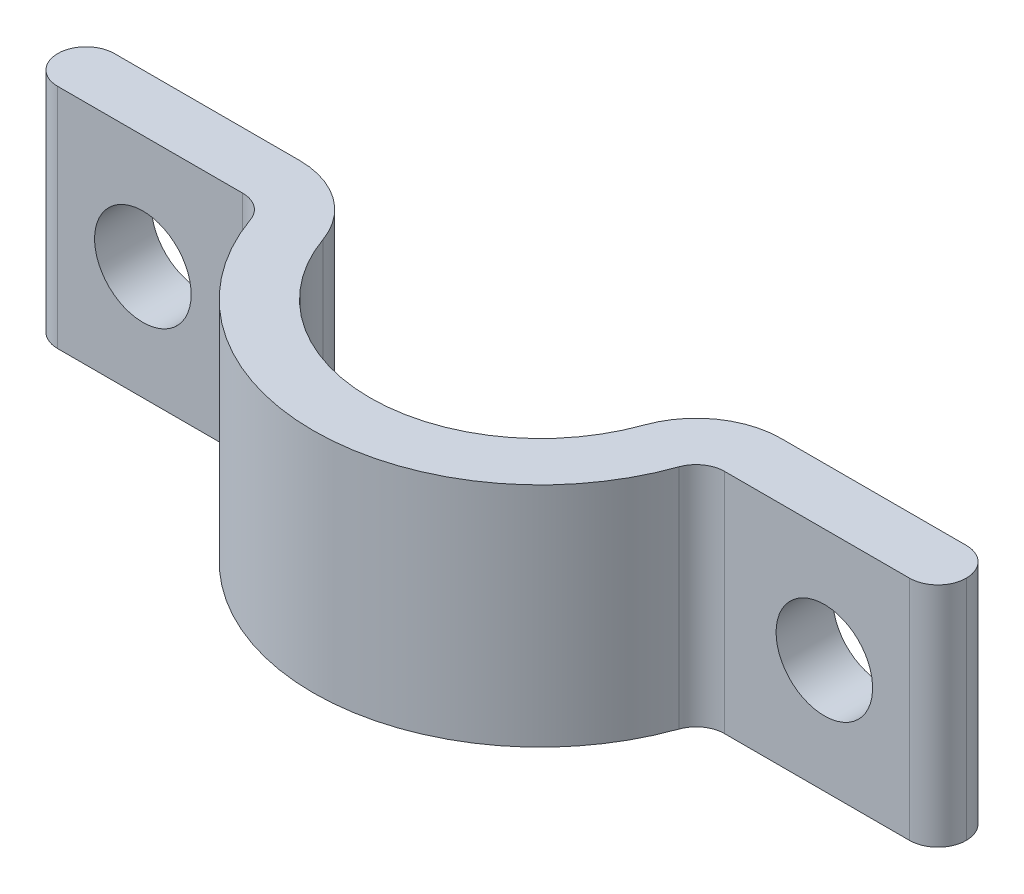
ISO-10303-21;
HEADER;
FILE_DESCRIPTION(('STEP AP214'),'2;1');
FILE_NAME('part.step','',(''),(''),'','','');
FILE_SCHEMA(('AUTOMOTIVE_DESIGN { 1 0 10303 214 1 1 1 1 }'));
ENDSEC;
DATA;
#1=APPLICATION_CONTEXT('core data for automotive mechanical design processes');
#2=APPLICATION_PROTOCOL_DEFINITION('international standard','automotive_design',2000,#1);
#3=PRODUCT_CONTEXT('',#1,'mechanical');
#4=PRODUCT('Part','Part','',(#3));
#5=PRODUCT_RELATED_PRODUCT_CATEGORY('part','',(#4));
#6=PRODUCT_DEFINITION_FORMATION('','',#4);
#7=PRODUCT_DEFINITION_CONTEXT('part definition',#1,'design');
#8=PRODUCT_DEFINITION('design','',#6,#7);
#9=PRODUCT_DEFINITION_SHAPE('','',#8);
#10=(LENGTH_UNIT() NAMED_UNIT(*) SI_UNIT(.MILLI.,.METRE.));
#11=(NAMED_UNIT(*) PLANE_ANGLE_UNIT() SI_UNIT($,.RADIAN.));
#12=(NAMED_UNIT(*) SI_UNIT($,.STERADIAN.) SOLID_ANGLE_UNIT());
#13=UNCERTAINTY_MEASURE_WITH_UNIT(LENGTH_MEASURE(1.E-05),#10,'distance_accuracy_value','');
#14=(GEOMETRIC_REPRESENTATION_CONTEXT(3) GLOBAL_UNCERTAINTY_ASSIGNED_CONTEXT((#13)) GLOBAL_UNIT_ASSIGNED_CONTEXT((#10,
#11,#12)) REPRESENTATION_CONTEXT('',''));
#15=CARTESIAN_POINT('',(0.,0.,0.));
#16=DIRECTION('',(0.,0.,1.));
#17=DIRECTION('',(1.,0.,0.));
#18=AXIS2_PLACEMENT_3D('',#15,#16,#17);
#19=CARTESIAN_POINT('',(-16.,8.,2.));
#20=DIRECTION('',(0.,0.,-1.));
#21=DIRECTION('',(-1.,0.,0.));
#22=AXIS2_PLACEMENT_3D('',#19,#20,#21);
#23=PLANE('',#22);
#24=CARTESIAN_POINT('',(-12.,4.,2.));
#25=DIRECTION('',(0.,0.,1.));
#26=DIRECTION('',(1.,0.,0.));
#27=AXIS2_PLACEMENT_3D('',#24,#25,#26);
#28=CIRCLE('',#27,1.7);
#29=CARTESIAN_POINT('',(-10.3,4.,2.));
#30=VERTEX_POINT('',#29);
#31=EDGE_CURVE('E206',#30,#30,#28,.T.);
#32=ORIENTED_EDGE('',*,*,#31,.F.);
#33=EDGE_LOOP('',(#32));
#34=FACE_BOUND('',#33,.T.);
#35=DIRECTION('',(1.,0.,0.));
#36=VECTOR('',#35,1.);
#37=CARTESIAN_POINT('',(-16.,8.,2.));
#38=LINE('',#37,#36);
#39=CARTESIAN_POINT('',(-15.,8.,2.));
#40=VERTEX_POINT('',#39);
#41=CARTESIAN_POINT('',(-8.48528137423857,8.,2.));
#42=VERTEX_POINT('',#41);
#43=EDGE_CURVE('E209',#40,#42,#38,.T.);
#44=ORIENTED_EDGE('',*,*,#43,.F.);
#45=DIRECTION('',(0.,-1.,0.));
#46=VECTOR('',#45,1.);
#47=CARTESIAN_POINT('',(-15.,8.,2.));
#48=LINE('',#47,#46);
#49=CARTESIAN_POINT('',(-15.,0.,2.));
#50=VERTEX_POINT('',#49);
#51=EDGE_CURVE('E11',#40,#50,#48,.T.);
#52=ORIENTED_EDGE('',*,*,#51,.T.);
#53=DIRECTION('',(1.,0.,0.));
#54=VECTOR('',#53,1.);
#55=CARTESIAN_POINT('',(-16.,0.,2.));
#56=LINE('',#55,#54);
#57=CARTESIAN_POINT('',(-8.48528137423857,0.,2.));
#58=VERTEX_POINT('',#57);
#59=EDGE_CURVE('E205',#50,#58,#56,.T.);
#60=ORIENTED_EDGE('',*,*,#59,.T.);
#61=DIRECTION('',(0.,-1.,0.));
#62=VECTOR('',#61,1.);
#63=CARTESIAN_POINT('',(-8.48528137423857,8.,2.));
#64=LINE('',#63,#62);
#65=EDGE_CURVE('E241',#42,#58,#64,.T.);
#66=ORIENTED_EDGE('',*,*,#65,.F.);
#67=EDGE_LOOP('',(#44,#52,#60,#66));
#68=FACE_BOUND('',#67,.T.);
#69=ADVANCED_FACE('F35',(#34,#68),#23,.F.);
#70=CARTESIAN_POINT('',(-8.48528137423857,8.,3.));
#71=DIRECTION('',(0.,-1.,0.));
#72=DIRECTION('',(0.,0.,-1.));
#73=AXIS2_PLACEMENT_3D('',#70,#71,#72);
#74=CYLINDRICAL_SURFACE('',#73,1.);
#75=CARTESIAN_POINT('',(-8.48528137423857,0.,3.));
#76=DIRECTION('',(0.,-1.,0.));
#77=DIRECTION('',(0.,0.,-1.));
#78=AXIS2_PLACEMENT_3D('',#75,#76,#77);
#79=CIRCLE('',#78,1.);
#80=CARTESIAN_POINT('',(-7.54247233265651,0.,2.66666666666666));
#81=VERTEX_POINT('',#80);
#82=EDGE_CURVE('E223',#58,#81,#79,.T.);
#83=ORIENTED_EDGE('',*,*,#82,.T.);
#84=DIRECTION('',(0.,-1.,0.));
#85=VECTOR('',#84,1.);
#86=CARTESIAN_POINT('',(-7.54247233265651,8.,2.66666666666666));
#87=LINE('',#86,#85);
#88=CARTESIAN_POINT('',(-7.54247233265651,8.,2.66666666666666));
#89=VERTEX_POINT('',#88);
#90=EDGE_CURVE('E238',#89,#81,#87,.T.);
#91=ORIENTED_EDGE('',*,*,#90,.F.);
#92=CARTESIAN_POINT('',(-8.48528137423857,8.,3.));
#93=DIRECTION('',(0.,-1.,0.));
#94=DIRECTION('',(0.,0.,-1.));
#95=AXIS2_PLACEMENT_3D('',#92,#93,#94);
#96=CIRCLE('',#95,1.);
#97=EDGE_CURVE('E211',#42,#89,#96,.T.);
#98=ORIENTED_EDGE('',*,*,#97,.F.);
#99=ORIENTED_EDGE('',*,*,#65,.T.);
#100=EDGE_LOOP('',(#83,#91,#98,#99));
#101=FACE_BOUND('',#100,.T.);
#102=ADVANCED_FACE('F281',(#101),#74,.F.);
#103=CARTESIAN_POINT('',(0.,8.,0.));
#104=DIRECTION('',(0.,-1.,0.));
#105=DIRECTION('',(0.,0.,-1.));
#106=AXIS2_PLACEMENT_3D('',#103,#104,#105);
#107=CYLINDRICAL_SURFACE('',#106,8.);
#108=CARTESIAN_POINT('',(0.,0.,0.));
#109=DIRECTION('',(0.,1.,0.));
#110=DIRECTION('',(0.,0.,1.));
#111=AXIS2_PLACEMENT_3D('',#108,#109,#110);
#112=CIRCLE('',#111,8.);
#113=CARTESIAN_POINT('',(7.54247233265651,0.,2.66666666666666));
#114=VERTEX_POINT('',#113);
#115=EDGE_CURVE('E225',#81,#114,#112,.T.);
#116=ORIENTED_EDGE('',*,*,#115,.T.);
#117=DIRECTION('',(0.,-1.,0.));
#118=VECTOR('',#117,1.);
#119=CARTESIAN_POINT('',(7.54247233265651,8.,2.66666666666666));
#120=LINE('',#119,#118);
#121=CARTESIAN_POINT('',(7.54247233265651,8.,2.66666666666666));
#122=VERTEX_POINT('',#121);
#123=EDGE_CURVE('E154',#122,#114,#120,.T.);
#124=ORIENTED_EDGE('',*,*,#123,.F.);
#125=CARTESIAN_POINT('',(0.,8.,0.));
#126=DIRECTION('',(0.,1.,0.));
#127=DIRECTION('',(0.,0.,1.));
#128=AXIS2_PLACEMENT_3D('',#125,#126,#127);
#129=CIRCLE('',#128,8.);
#130=EDGE_CURVE('E139',#89,#122,#129,.T.);
#131=ORIENTED_EDGE('',*,*,#130,.F.);
#132=ORIENTED_EDGE('',*,*,#90,.T.);
#133=EDGE_LOOP('',(#116,#124,#131,#132));
#134=FACE_BOUND('',#133,.T.);
#135=ADVANCED_FACE('F284',(#134),#107,.T.);
#136=CARTESIAN_POINT('',(0.,8.,0.));
#137=DIRECTION('',(0.,-1.,0.));
#138=DIRECTION('',(0.,0.,-1.));
#139=AXIS2_PLACEMENT_3D('',#136,#137,#138);
#140=CYLINDRICAL_SURFACE('',#139,6.);
#141=CARTESIAN_POINT('',(0.,0.,0.));
#142=DIRECTION('',(0.,-1.,0.));
#143=DIRECTION('',(0.,0.,1.));
#144=AXIS2_PLACEMENT_3D('',#141,#142,#143);
#145=CIRCLE('',#144,6.);
#146=CARTESIAN_POINT('',(5.65685424949238,0.,1.99999999999999));
#147=VERTEX_POINT('',#146);
#148=CARTESIAN_POINT('',(-5.65685424949238,0.,2.));
#149=VERTEX_POINT('',#148);
#150=EDGE_CURVE('E227',#147,#149,#145,.T.);
#151=ORIENTED_EDGE('',*,*,#150,.T.);
#152=DIRECTION('',(0.,-1.,0.));
#153=VECTOR('',#152,1.);
#154=CARTESIAN_POINT('',(-5.65685424949238,8.,2.));
#155=LINE('',#154,#153);
#156=CARTESIAN_POINT('',(-5.65685424949238,8.,2.));
#157=VERTEX_POINT('',#156);
#158=EDGE_CURVE('E235',#157,#149,#155,.T.);
#159=ORIENTED_EDGE('',*,*,#158,.F.);
#160=CARTESIAN_POINT('',(0.,8.,0.));
#161=DIRECTION('',(0.,-1.,0.));
#162=DIRECTION('',(0.,0.,1.));
#163=AXIS2_PLACEMENT_3D('',#160,#161,#162);
#164=CIRCLE('',#163,6.);
#165=CARTESIAN_POINT('',(5.65685424949238,8.,1.99999999999999));
#166=VERTEX_POINT('',#165);
#167=EDGE_CURVE('E215',#166,#157,#164,.T.);
#168=ORIENTED_EDGE('',*,*,#167,.F.);
#169=DIRECTION('',(0.,-1.,0.));
#170=VECTOR('',#169,1.);
#171=CARTESIAN_POINT('',(5.65685424949238,8.,1.99999999999999));
#172=LINE('',#171,#170);
#173=EDGE_CURVE('E183',#166,#147,#172,.T.);
#174=ORIENTED_EDGE('',*,*,#173,.T.);
#175=EDGE_LOOP('',(#151,#159,#168,#174));
#176=FACE_BOUND('',#175,.T.);
#177=ADVANCED_FACE('F299',(#176),#140,.F.);
#178=CARTESIAN_POINT('',(-8.48528137423857,8.,3.));
#179=DIRECTION('',(0.,-1.,0.));
#180=DIRECTION('',(0.,0.,-1.));
#181=AXIS2_PLACEMENT_3D('',#178,#179,#180);
#182=CYLINDRICAL_SURFACE('',#181,3.);
#183=CARTESIAN_POINT('',(-8.48528137423857,0.,3.));
#184=DIRECTION('',(0.,1.,0.));
#185=DIRECTION('',(0.,0.,-1.));
#186=AXIS2_PLACEMENT_3D('',#183,#184,#185);
#187=CIRCLE('',#186,3.);
#188=CARTESIAN_POINT('',(-8.48528137423857,0.,0.));
#189=VERTEX_POINT('',#188);
#190=EDGE_CURVE('E229',#149,#189,#187,.T.);
#191=ORIENTED_EDGE('',*,*,#190,.T.);
#192=DIRECTION('',(0.,-1.,0.));
#193=VECTOR('',#192,1.);
#194=CARTESIAN_POINT('',(-8.48528137423857,8.,0.));
#195=LINE('',#194,#193);
#196=CARTESIAN_POINT('',(-8.48528137423857,8.,0.));
#197=VERTEX_POINT('',#196);
#198=EDGE_CURVE('E221',#197,#189,#195,.T.);
#199=ORIENTED_EDGE('',*,*,#198,.F.);
#200=CARTESIAN_POINT('',(-8.48528137423857,8.,3.));
#201=DIRECTION('',(0.,1.,0.));
#202=DIRECTION('',(0.,0.,-1.));
#203=AXIS2_PLACEMENT_3D('',#200,#201,#202);
#204=CIRCLE('',#203,3.);
#205=EDGE_CURVE('E217',#157,#197,#204,.T.);
#206=ORIENTED_EDGE('',*,*,#205,.F.);
#207=ORIENTED_EDGE('',*,*,#158,.T.);
#208=EDGE_LOOP('',(#191,#199,#206,#207));
#209=FACE_BOUND('',#208,.T.);
#210=ADVANCED_FACE('F264',(#209),#182,.T.);
#211=CARTESIAN_POINT('',(-16.,8.,0.));
#212=DIRECTION('',(0.,0.,1.));
#213=DIRECTION('',(1.,0.,0.));
#214=AXIS2_PLACEMENT_3D('',#211,#212,#213);
#215=PLANE('',#214);
#216=CARTESIAN_POINT('',(-12.,4.,0.));
#217=DIRECTION('',(0.,0.,1.));
#218=DIRECTION('',(1.,0.,0.));
#219=AXIS2_PLACEMENT_3D('',#216,#217,#218);
#220=CIRCLE('',#219,1.7);
#221=CARTESIAN_POINT('',(-10.3,4.,0.));
#222=VERTEX_POINT('',#221);
#223=EDGE_CURVE('E202',#222,#222,#220,.T.);
#224=ORIENTED_EDGE('',*,*,#223,.T.);
#225=EDGE_LOOP('',(#224));
#226=FACE_BOUND('',#225,.T.);
#227=DIRECTION('',(-1.,0.,0.));
#228=VECTOR('',#227,1.);
#229=CARTESIAN_POINT('',(-16.,0.,0.));
#230=LINE('',#229,#228);
#231=CARTESIAN_POINT('',(-15.,0.,0.));
#232=VERTEX_POINT('',#231);
#233=EDGE_CURVE('E212',#189,#232,#230,.T.);
#234=ORIENTED_EDGE('',*,*,#233,.T.);
#235=DIRECTION('',(0.,-1.,0.));
#236=VECTOR('',#235,1.);
#237=CARTESIAN_POINT('',(-15.,8.,0.));
#238=LINE('',#237,#236);
#239=CARTESIAN_POINT('',(-15.,8.,0.));
#240=VERTEX_POINT('',#239);
#241=EDGE_CURVE('E248',#232,#240,#238,.F.);
#242=ORIENTED_EDGE('',*,*,#241,.T.);
#243=DIRECTION('',(-1.,0.,0.));
#244=VECTOR('',#243,1.);
#245=CARTESIAN_POINT('',(-16.,8.,0.));
#246=LINE('',#245,#244);
#247=EDGE_CURVE('E219',#197,#240,#246,.T.);
#248=ORIENTED_EDGE('',*,*,#247,.F.);
#249=ORIENTED_EDGE('',*,*,#198,.T.);
#250=EDGE_LOOP('',(#234,#242,#248,#249));
#251=FACE_BOUND('',#250,.T.);
#252=ADVANCED_FACE('F255',(#226,#251),#215,.F.);
#253=CARTESIAN_POINT('',(-8.48528137423857,8.,3.));
#254=DIRECTION('',(0.,-1.,0.));
#255=DIRECTION('',(0.,0.,-1.));
#256=AXIS2_PLACEMENT_3D('',#253,#254,#255);
#257=PLANE('',#256);
#258=ORIENTED_EDGE('',*,*,#247,.T.);
#259=CARTESIAN_POINT('',(-15.,8.,1.));
#260=DIRECTION('',(0.,-1.,0.));
#261=DIRECTION('',(0.,0.,-1.));
#262=AXIS2_PLACEMENT_3D('',#259,#260,#261);
#263=CIRCLE('',#262,1.);
#264=CARTESIAN_POINT('',(-16.,8.,0.999999999999998));
#265=VERTEX_POINT('',#264);
#266=EDGE_CURVE('E44',#240,#265,#263,.F.);
#267=ORIENTED_EDGE('',*,*,#266,.T.);
#268=CARTESIAN_POINT('',(-15.,8.,1.));
#269=DIRECTION('',(0.,-1.,0.));
#270=DIRECTION('',(0.,0.,-1.));
#271=AXIS2_PLACEMENT_3D('',#268,#269,#270);
#272=CIRCLE('',#271,1.);
#273=EDGE_CURVE('E51',#265,#40,#272,.F.);
#274=ORIENTED_EDGE('',*,*,#273,.T.);
#275=ORIENTED_EDGE('',*,*,#43,.T.);
#276=ORIENTED_EDGE('',*,*,#97,.T.);
#277=ORIENTED_EDGE('',*,*,#130,.T.);
#278=CARTESIAN_POINT('',(8.48528137423857,8.,2.99999999999999));
#279=DIRECTION('',(0.,1.,0.));
#280=DIRECTION('',(0.,0.,-1.));
#281=AXIS2_PLACEMENT_3D('',#278,#279,#280);
#282=CIRCLE('',#281,1.);
#283=CARTESIAN_POINT('',(8.48528137423857,8.,1.99999999999999));
#284=VERTEX_POINT('',#283);
#285=EDGE_CURVE('E132',#284,#122,#282,.T.);
#286=ORIENTED_EDGE('',*,*,#285,.F.);
#287=DIRECTION('',(-1.,0.,0.));
#288=VECTOR('',#287,1.);
#289=CARTESIAN_POINT('',(16.,8.,1.99999999999998));
#290=LINE('',#289,#288);
#291=CARTESIAN_POINT('',(15.,8.,1.99999999999999));
#292=VERTEX_POINT('',#291);
#293=EDGE_CURVE('E137',#292,#284,#290,.T.);
#294=ORIENTED_EDGE('',*,*,#293,.F.);
#295=CARTESIAN_POINT('',(15.,8.,0.999999999999985));
#296=DIRECTION('',(0.,1.,0.));
#297=DIRECTION('',(0.,0.,-1.));
#298=AXIS2_PLACEMENT_3D('',#295,#296,#297);
#299=CIRCLE('',#298,1.);
#300=CARTESIAN_POINT('',(16.,8.,0.999999999999983));
#301=VERTEX_POINT('',#300);
#302=EDGE_CURVE('E194',#301,#292,#299,.F.);
#303=ORIENTED_EDGE('',*,*,#302,.F.);
#304=CARTESIAN_POINT('',(15.,8.,0.999999999999985));
#305=DIRECTION('',(0.,1.,0.));
#306=DIRECTION('',(0.,0.,-1.));
#307=AXIS2_PLACEMENT_3D('',#304,#305,#306);
#308=CIRCLE('',#307,1.);
#309=CARTESIAN_POINT('',(15.,8.,0.));
#310=VERTEX_POINT('',#309);
#311=EDGE_CURVE('E196',#310,#301,#308,.F.);
#312=ORIENTED_EDGE('',*,*,#311,.F.);
#313=DIRECTION('',(1.,0.,0.));
#314=VECTOR('',#313,1.);
#315=CARTESIAN_POINT('',(16.,8.,0.));
#316=LINE('',#315,#314);
#317=CARTESIAN_POINT('',(8.48528137423857,8.,0.));
#318=VERTEX_POINT('',#317);
#319=EDGE_CURVE('E171',#318,#310,#316,.T.);
#320=ORIENTED_EDGE('',*,*,#319,.F.);
#321=CARTESIAN_POINT('',(8.48528137423857,8.,2.99999999999999));
#322=DIRECTION('',(0.,-1.,0.));
#323=DIRECTION('',(0.,0.,-1.));
#324=AXIS2_PLACEMENT_3D('',#321,#322,#323);
#325=CIRCLE('',#324,3.);
#326=EDGE_CURVE('E143',#166,#318,#325,.T.);
#327=ORIENTED_EDGE('',*,*,#326,.F.);
#328=ORIENTED_EDGE('',*,*,#167,.T.);
#329=ORIENTED_EDGE('',*,*,#205,.T.);
#330=EDGE_LOOP('',(#258,#267,#274,#275,#276,#277,#286,#294,#303,#312,#320,#327,#328,#329));
#331=FACE_BOUND('',#330,.T.);
#332=ADVANCED_FACE('F134',(#331),#257,.F.);
#333=CARTESIAN_POINT('',(-8.48528137423857,0.,3.));
#334=DIRECTION('',(0.,-1.,0.));
#335=DIRECTION('',(0.,0.,-1.));
#336=AXIS2_PLACEMENT_3D('',#333,#334,#335);
#337=PLANE('',#336);
#338=CARTESIAN_POINT('',(-15.,0.,1.));
#339=DIRECTION('',(0.,-1.,0.));
#340=DIRECTION('',(0.,0.,-1.));
#341=AXIS2_PLACEMENT_3D('',#338,#339,#340);
#342=CIRCLE('',#341,1.);
#343=CARTESIAN_POINT('',(-16.,0.,0.999999999999998));
#344=VERTEX_POINT('',#343);
#345=EDGE_CURVE('E244',#50,#344,#342,.T.);
#346=ORIENTED_EDGE('',*,*,#345,.T.);
#347=CARTESIAN_POINT('',(-15.,0.,1.));
#348=DIRECTION('',(0.,-1.,0.));
#349=DIRECTION('',(0.,0.,-1.));
#350=AXIS2_PLACEMENT_3D('',#347,#348,#349);
#351=CIRCLE('',#350,1.);
#352=EDGE_CURVE('E246',#344,#232,#351,.T.);
#353=ORIENTED_EDGE('',*,*,#352,.T.);
#354=ORIENTED_EDGE('',*,*,#233,.F.);
#355=ORIENTED_EDGE('',*,*,#190,.F.);
#356=ORIENTED_EDGE('',*,*,#150,.F.);
#357=CARTESIAN_POINT('',(8.48528137423857,0.,2.99999999999999));
#358=DIRECTION('',(0.,-1.,0.));
#359=DIRECTION('',(0.,0.,-1.));
#360=AXIS2_PLACEMENT_3D('',#357,#358,#359);
#361=CIRCLE('',#360,3.);
#362=CARTESIAN_POINT('',(8.48528137423857,0.,0.));
#363=VERTEX_POINT('',#362);
#364=EDGE_CURVE('E163',#147,#363,#361,.T.);
#365=ORIENTED_EDGE('',*,*,#364,.T.);
#366=DIRECTION('',(1.,0.,0.));
#367=VECTOR('',#366,1.);
#368=CARTESIAN_POINT('',(16.,0.,0.));
#369=LINE('',#368,#367);
#370=CARTESIAN_POINT('',(15.,0.,0.));
#371=VERTEX_POINT('',#370);
#372=EDGE_CURVE('E160',#363,#371,#369,.T.);
#373=ORIENTED_EDGE('',*,*,#372,.T.);
#374=CARTESIAN_POINT('',(15.,0.,0.999999999999985));
#375=DIRECTION('',(0.,1.,0.));
#376=DIRECTION('',(0.,0.,-1.));
#377=AXIS2_PLACEMENT_3D('',#374,#375,#376);
#378=CIRCLE('',#377,1.);
#379=CARTESIAN_POINT('',(16.,0.,0.999999999999983));
#380=VERTEX_POINT('',#379);
#381=EDGE_CURVE('E189',#380,#371,#378,.T.);
#382=ORIENTED_EDGE('',*,*,#381,.F.);
#383=CARTESIAN_POINT('',(15.,0.,0.999999999999985));
#384=DIRECTION('',(0.,1.,0.));
#385=DIRECTION('',(0.,0.,-1.));
#386=AXIS2_PLACEMENT_3D('',#383,#384,#385);
#387=CIRCLE('',#386,1.);
#388=CARTESIAN_POINT('',(15.,0.,1.99999999999999));
#389=VERTEX_POINT('',#388);
#390=EDGE_CURVE('E153',#389,#380,#387,.T.);
#391=ORIENTED_EDGE('',*,*,#390,.F.);
#392=DIRECTION('',(-1.,0.,0.));
#393=VECTOR('',#392,1.);
#394=CARTESIAN_POINT('',(16.,0.,1.99999999999998));
#395=LINE('',#394,#393);
#396=CARTESIAN_POINT('',(8.48528137423857,0.,1.99999999999999));
#397=VERTEX_POINT('',#396);
#398=EDGE_CURVE('E175',#389,#397,#395,.T.);
#399=ORIENTED_EDGE('',*,*,#398,.T.);
#400=CARTESIAN_POINT('',(8.48528137423857,0.,2.99999999999999));
#401=DIRECTION('',(0.,1.,0.));
#402=DIRECTION('',(0.,0.,-1.));
#403=AXIS2_PLACEMENT_3D('',#400,#401,#402);
#404=CIRCLE('',#403,1.);
#405=EDGE_CURVE('E149',#397,#114,#404,.T.);
#406=ORIENTED_EDGE('',*,*,#405,.T.);
#407=ORIENTED_EDGE('',*,*,#115,.F.);
#408=ORIENTED_EDGE('',*,*,#82,.F.);
#409=ORIENTED_EDGE('',*,*,#59,.F.);
#410=EDGE_LOOP('',(#346,#353,#354,#355,#356,#365,#373,#382,#391,#399,#406,#407,#408,#409));
#411=FACE_BOUND('',#410,.T.);
#412=ADVANCED_FACE('F267',(#411),#337,.T.);
#413=CARTESIAN_POINT('',(-12.,4.,0.));
#414=DIRECTION('',(0.,0.,1.));
#415=DIRECTION('',(1.,0.,0.));
#416=AXIS2_PLACEMENT_3D('',#413,#414,#415);
#417=CYLINDRICAL_SURFACE('',#416,1.7);
#418=ORIENTED_EDGE('',*,*,#223,.F.);
#419=EDGE_LOOP('',(#418));
#420=FACE_BOUND('',#419,.T.);
#421=ORIENTED_EDGE('',*,*,#31,.T.);
#422=EDGE_LOOP('',(#421));
#423=FACE_BOUND('',#422,.T.);
#424=ADVANCED_FACE('F323',(#420,#423),#417,.F.);
#425=CARTESIAN_POINT('',(-15.,8.,1.));
#426=DIRECTION('',(0.,-1.,0.));
#427=DIRECTION('',(0.,0.,-1.));
#428=AXIS2_PLACEMENT_3D('',#425,#426,#427);
#429=CYLINDRICAL_SURFACE('',#428,1.);
#430=ORIENTED_EDGE('',*,*,#51,.F.);
#431=ORIENTED_EDGE('',*,*,#273,.F.);
#432=DIRECTION('',(0.,-1.,0.));
#433=VECTOR('',#432,1.);
#434=CARTESIAN_POINT('',(-16.,8.,0.999999999999998));
#435=LINE('',#434,#433);
#436=EDGE_CURVE('E39',#344,#265,#435,.F.);
#437=ORIENTED_EDGE('',*,*,#436,.F.);
#438=ORIENTED_EDGE('',*,*,#345,.F.);
#439=EDGE_LOOP('',(#430,#431,#437,#438));
#440=FACE_BOUND('',#439,.T.);
#441=ADVANCED_FACE('F37',(#440),#429,.T.);
#442=CARTESIAN_POINT('',(-15.,8.,1.));
#443=DIRECTION('',(0.,-1.,0.));
#444=DIRECTION('',(0.,0.,-1.));
#445=AXIS2_PLACEMENT_3D('',#442,#443,#444);
#446=CYLINDRICAL_SURFACE('',#445,1.);
#447=ORIENTED_EDGE('',*,*,#266,.F.);
#448=ORIENTED_EDGE('',*,*,#241,.F.);
#449=ORIENTED_EDGE('',*,*,#352,.F.);
#450=ORIENTED_EDGE('',*,*,#436,.T.);
#451=EDGE_LOOP('',(#447,#448,#449,#450));
#452=FACE_BOUND('',#451,.T.);
#453=ADVANCED_FACE('F272',(#452),#446,.T.);
#454=CARTESIAN_POINT('',(16.,8.,1.99999999999998));
#455=DIRECTION('',(0.,0.,-1.));
#456=DIRECTION('',(1.,0.,0.));
#457=AXIS2_PLACEMENT_3D('',#454,#455,#456);
#458=PLANE('',#457);
#459=CARTESIAN_POINT('',(12.,4.,1.99999999999999));
#460=DIRECTION('',(0.,0.,-1.));
#461=DIRECTION('',(-1.,0.,0.));
#462=AXIS2_PLACEMENT_3D('',#459,#460,#461);
#463=CIRCLE('',#462,1.7);
#464=CARTESIAN_POINT('',(10.3,4.,1.99999999999999));
#465=VERTEX_POINT('',#464);
#466=EDGE_CURVE('E166',#465,#465,#463,.T.);
#467=ORIENTED_EDGE('',*,*,#466,.T.);
#468=EDGE_LOOP('',(#467));
#469=FACE_BOUND('',#468,.T.);
#470=ORIENTED_EDGE('',*,*,#293,.T.);
#471=DIRECTION('',(0.,-1.,0.));
#472=VECTOR('',#471,1.);
#473=CARTESIAN_POINT('',(8.48528137423857,8.,1.99999999999999));
#474=LINE('',#473,#472);
#475=EDGE_CURVE('E146',#284,#397,#474,.T.);
#476=ORIENTED_EDGE('',*,*,#475,.T.);
#477=ORIENTED_EDGE('',*,*,#398,.F.);
#478=DIRECTION('',(0.,-1.,0.));
#479=VECTOR('',#478,1.);
#480=CARTESIAN_POINT('',(15.,8.,1.99999999999999));
#481=LINE('',#480,#479);
#482=EDGE_CURVE('E159',#292,#389,#481,.T.);
#483=ORIENTED_EDGE('',*,*,#482,.F.);
#484=EDGE_LOOP('',(#470,#476,#477,#483));
#485=FACE_BOUND('',#484,.T.);
#486=ADVANCED_FACE('F157',(#469,#485),#458,.F.);
#487=CARTESIAN_POINT('',(8.48528137423857,8.,2.99999999999999));
#488=DIRECTION('',(0.,-1.,0.));
#489=DIRECTION('',(0.,0.,-1.));
#490=AXIS2_PLACEMENT_3D('',#487,#488,#489);
#491=CYLINDRICAL_SURFACE('',#490,1.);
#492=ORIENTED_EDGE('',*,*,#405,.F.);
#493=ORIENTED_EDGE('',*,*,#475,.F.);
#494=ORIENTED_EDGE('',*,*,#285,.T.);
#495=ORIENTED_EDGE('',*,*,#123,.T.);
#496=EDGE_LOOP('',(#492,#493,#494,#495));
#497=FACE_BOUND('',#496,.T.);
#498=ADVANCED_FACE('F147',(#497),#491,.F.);
#499=CARTESIAN_POINT('',(8.48528137423857,8.,2.99999999999999));
#500=DIRECTION('',(0.,-1.,0.));
#501=DIRECTION('',(0.,0.,-1.));
#502=AXIS2_PLACEMENT_3D('',#499,#500,#501);
#503=CYLINDRICAL_SURFACE('',#502,3.);
#504=ORIENTED_EDGE('',*,*,#364,.F.);
#505=ORIENTED_EDGE('',*,*,#173,.F.);
#506=ORIENTED_EDGE('',*,*,#326,.T.);
#507=DIRECTION('',(0.,-1.,0.));
#508=VECTOR('',#507,1.);
#509=CARTESIAN_POINT('',(8.48528137423857,8.,0.));
#510=LINE('',#509,#508);
#511=EDGE_CURVE('E174',#318,#363,#510,.T.);
#512=ORIENTED_EDGE('',*,*,#511,.T.);
#513=EDGE_LOOP('',(#504,#505,#506,#512));
#514=FACE_BOUND('',#513,.T.);
#515=ADVANCED_FACE('F297',(#514),#503,.T.);
#516=CARTESIAN_POINT('',(16.,8.,0.));
#517=DIRECTION('',(0.,0.,1.));
#518=DIRECTION('',(-1.,0.,0.));
#519=AXIS2_PLACEMENT_3D('',#516,#517,#518);
#520=PLANE('',#519);
#521=CARTESIAN_POINT('',(12.,4.,0.));
#522=DIRECTION('',(0.,0.,-1.));
#523=DIRECTION('',(-1.,0.,0.));
#524=AXIS2_PLACEMENT_3D('',#521,#522,#523);
#525=CIRCLE('',#524,1.7);
#526=CARTESIAN_POINT('',(10.3,4.,0.));
#527=VERTEX_POINT('',#526);
#528=EDGE_CURVE('E177',#527,#527,#525,.T.);
#529=ORIENTED_EDGE('',*,*,#528,.F.);
#530=EDGE_LOOP('',(#529));
#531=FACE_BOUND('',#530,.T.);
#532=ORIENTED_EDGE('',*,*,#372,.F.);
#533=ORIENTED_EDGE('',*,*,#511,.F.);
#534=ORIENTED_EDGE('',*,*,#319,.T.);
#535=DIRECTION('',(0.,-1.,0.));
#536=VECTOR('',#535,1.);
#537=CARTESIAN_POINT('',(15.,8.,0.));
#538=LINE('',#537,#536);
#539=EDGE_CURVE('E191',#371,#310,#538,.F.);
#540=ORIENTED_EDGE('',*,*,#539,.F.);
#541=EDGE_LOOP('',(#532,#533,#534,#540));
#542=FACE_BOUND('',#541,.T.);
#543=ADVANCED_FACE('F293',(#531,#542),#520,.F.);
#544=CARTESIAN_POINT('',(12.,4.,0.));
#545=DIRECTION('',(0.,0.,1.));
#546=DIRECTION('',(-1.,0.,0.));
#547=AXIS2_PLACEMENT_3D('',#544,#545,#546);
#548=CYLINDRICAL_SURFACE('',#547,1.7);
#549=ORIENTED_EDGE('',*,*,#528,.T.);
#550=EDGE_LOOP('',(#549));
#551=FACE_BOUND('',#550,.T.);
#552=ORIENTED_EDGE('',*,*,#466,.F.);
#553=EDGE_LOOP('',(#552));
#554=FACE_BOUND('',#553,.T.);
#555=ADVANCED_FACE('F388',(#551,#554),#548,.F.);
#556=CARTESIAN_POINT('',(15.,8.,0.999999999999985));
#557=DIRECTION('',(0.,-1.,0.));
#558=DIRECTION('',(0.,0.,-1.));
#559=AXIS2_PLACEMENT_3D('',#556,#557,#558);
#560=CYLINDRICAL_SURFACE('',#559,1.);
#561=ORIENTED_EDGE('',*,*,#482,.T.);
#562=ORIENTED_EDGE('',*,*,#390,.T.);
#563=DIRECTION('',(0.,-1.,0.));
#564=VECTOR('',#563,1.);
#565=CARTESIAN_POINT('',(16.,8.,0.999999999999983));
#566=LINE('',#565,#564);
#567=EDGE_CURVE('E200',#380,#301,#566,.F.);
#568=ORIENTED_EDGE('',*,*,#567,.T.);
#569=ORIENTED_EDGE('',*,*,#302,.T.);
#570=EDGE_LOOP('',(#561,#562,#568,#569));
#571=FACE_BOUND('',#570,.T.);
#572=ADVANCED_FACE('F287',(#571),#560,.T.);
#573=CARTESIAN_POINT('',(15.,8.,0.999999999999985));
#574=DIRECTION('',(0.,-1.,0.));
#575=DIRECTION('',(0.,0.,-1.));
#576=AXIS2_PLACEMENT_3D('',#573,#574,#575);
#577=CYLINDRICAL_SURFACE('',#576,1.);
#578=ORIENTED_EDGE('',*,*,#311,.T.);
#579=ORIENTED_EDGE('',*,*,#567,.F.);
#580=ORIENTED_EDGE('',*,*,#381,.T.);
#581=ORIENTED_EDGE('',*,*,#539,.T.);
#582=EDGE_LOOP('',(#578,#579,#580,#581));
#583=FACE_BOUND('',#582,.T.);
#584=ADVANCED_FACE('F291',(#583),#577,.T.);
#585=CLOSED_SHELL('',(#69,#102,#135,#177,#210,#252,#332,#412,#424,#441,#453,#486,#498,#515,#543,
#555,#572,#584));
#586=MANIFOLD_SOLID_BREP('B2',#585);
#587=ADVANCED_BREP_SHAPE_REPRESENTATION('',(#18,#586),#14);
#588=SHAPE_DEFINITION_REPRESENTATION(#9,#587);
ENDSEC;
END-ISO-10303-21;
